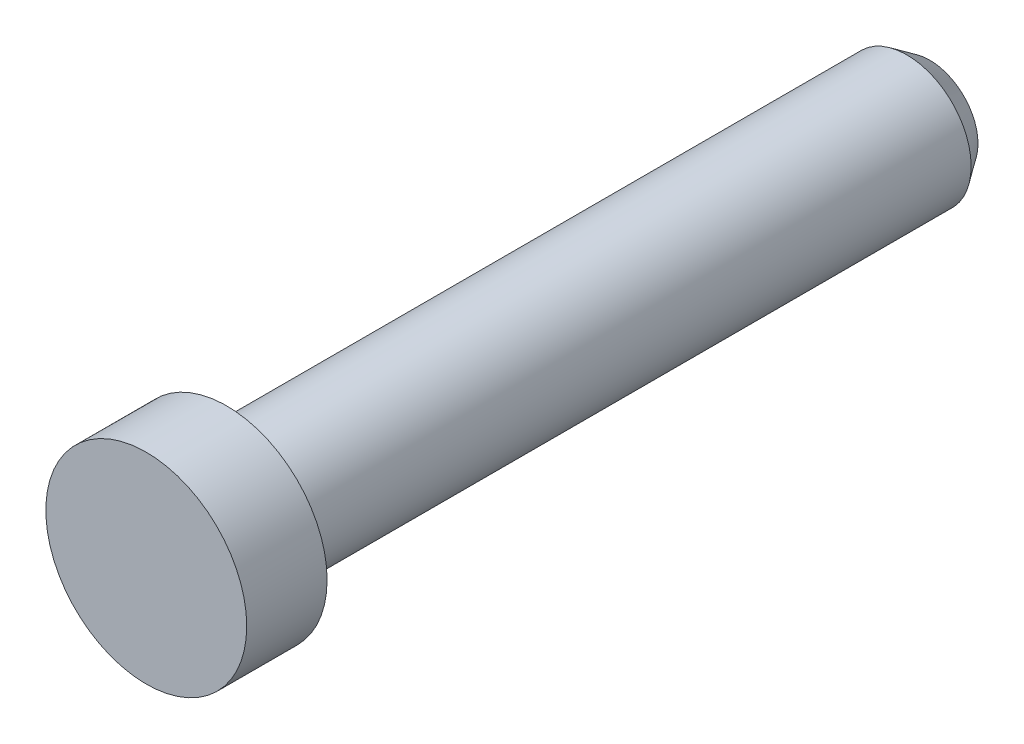
ISO-10303-21;
HEADER;
FILE_DESCRIPTION(('STEP AP214'),'2;1');
FILE_NAME('part.step','',(''),(''),'','','');
FILE_SCHEMA(('AUTOMOTIVE_DESIGN { 1 0 10303 214 1 1 1 1 }'));
ENDSEC;
DATA;
#1=APPLICATION_CONTEXT('core data for automotive mechanical design processes');
#2=APPLICATION_PROTOCOL_DEFINITION('international standard','automotive_design',2000,#1);
#3=PRODUCT_CONTEXT('',#1,'mechanical');
#4=PRODUCT('Part','Part','',(#3));
#5=PRODUCT_RELATED_PRODUCT_CATEGORY('part','',(#4));
#6=PRODUCT_DEFINITION_FORMATION('','',#4);
#7=PRODUCT_DEFINITION_CONTEXT('part definition',#1,'design');
#8=PRODUCT_DEFINITION('design','',#6,#7);
#9=PRODUCT_DEFINITION_SHAPE('','',#8);
#10=(LENGTH_UNIT() NAMED_UNIT(*) SI_UNIT(.MILLI.,.METRE.));
#11=(NAMED_UNIT(*) PLANE_ANGLE_UNIT() SI_UNIT($,.RADIAN.));
#12=(NAMED_UNIT(*) SI_UNIT($,.STERADIAN.) SOLID_ANGLE_UNIT());
#13=UNCERTAINTY_MEASURE_WITH_UNIT(LENGTH_MEASURE(1.E-05),#10,'distance_accuracy_value','');
#14=(GEOMETRIC_REPRESENTATION_CONTEXT(3) GLOBAL_UNCERTAINTY_ASSIGNED_CONTEXT((#13)) GLOBAL_UNIT_ASSIGNED_CONTEXT((#10,
#11,#12)) REPRESENTATION_CONTEXT('',''));
#15=CARTESIAN_POINT('',(0.,0.,0.));
#16=DIRECTION('',(0.,0.,1.));
#17=DIRECTION('',(1.,0.,0.));
#18=AXIS2_PLACEMENT_3D('',#15,#16,#17);
#19=CARTESIAN_POINT('',(0.,0.,8.75));
#20=DIRECTION('',(0.,0.,-1.));
#21=DIRECTION('',(-1.,0.,0.));
#22=AXIS2_PLACEMENT_3D('',#19,#20,#21);
#23=CYLINDRICAL_SURFACE('',#22,1.6);
#24=CARTESIAN_POINT('',(0.,0.,-8.17874079730315));
#25=DIRECTION('',(0.,0.,1.));
#26=DIRECTION('',(1.,0.,0.));
#27=AXIS2_PLACEMENT_3D('',#24,#25,#26);
#28=CIRCLE('',#27,1.6);
#29=CARTESIAN_POINT('',(1.6,0.,-8.17874079730315));
#30=VERTEX_POINT('',#29);
#31=EDGE_CURVE('E54',#30,#30,#28,.T.);
#32=ORIENTED_EDGE('',*,*,#31,.T.);
#33=EDGE_LOOP('',(#32));
#34=FACE_BOUND('',#33,.T.);
#35=CARTESIAN_POINT('',(0.,0.,8.75));
#36=DIRECTION('',(0.,0.,1.));
#37=DIRECTION('',(1.,0.,0.));
#38=AXIS2_PLACEMENT_3D('',#35,#36,#37);
#39=CIRCLE('',#38,1.6);
#40=CARTESIAN_POINT('',(1.6,0.,8.75));
#41=VERTEX_POINT('',#40);
#42=EDGE_CURVE('E59',#41,#41,#39,.T.);
#43=ORIENTED_EDGE('',*,*,#42,.F.);
#44=EDGE_LOOP('',(#43));
#45=FACE_BOUND('',#44,.T.);
#46=ADVANCED_FACE('F45',(#34,#45),#23,.T.);
#47=CARTESIAN_POINT('',(0.,0.,-8.75));
#48=DIRECTION('',(0.,0.,1.));
#49=DIRECTION('',(1.,0.,0.));
#50=AXIS2_PLACEMENT_3D('',#47,#48,#49);
#51=PLANE('',#50);
#52=CARTESIAN_POINT('',(0.,0.,-8.75));
#53=DIRECTION('',(0.,0.,1.));
#54=DIRECTION('',(1.,0.,0.));
#55=AXIS2_PLACEMENT_3D('',#52,#53,#54);
#56=CIRCLE('',#55,1.2);
#57=CARTESIAN_POINT('',(1.2,0.,-8.75));
#58=VERTEX_POINT('',#57);
#59=EDGE_CURVE('E10',#58,#58,#56,.F.);
#60=ORIENTED_EDGE('',*,*,#59,.T.);
#61=EDGE_LOOP('',(#60));
#62=FACE_BOUND('',#61,.T.);
#63=ADVANCED_FACE('F92',(#62),#51,.F.);
#64=CARTESIAN_POINT('',(0.,0.,-8.17874079730315));
#65=DIRECTION('',(0.,0.,1.));
#66=DIRECTION('',(1.,0.,0.));
#67=AXIS2_PLACEMENT_3D('',#64,#65,#66);
#68=CONICAL_SURFACE('',#67,1.6,0.610865238198017);
#69=CARTESIAN_POINT('',(1.2,0.,-8.75));
#70=CARTESIAN_POINT('',(1.20416666666666,0.,-8.74404938330524));
#71=CARTESIAN_POINT('',(1.20833333333333,0.,-8.73809876661048));
#72=CARTESIAN_POINT('',(1.21666666666666,0.,-8.72619753322097));
#73=CARTESIAN_POINT('',(1.22083333333333,0.,-8.72024691652621));
#74=CARTESIAN_POINT('',(1.22916666666666,0.,-8.70834568313669));
#75=CARTESIAN_POINT('',(1.23333333333333,0.,-8.70239506644193));
#76=CARTESIAN_POINT('',(1.24166666666666,0.,-8.69049383305241));
#77=CARTESIAN_POINT('',(1.24583333333333,0.,-8.68454321635766));
#78=CARTESIAN_POINT('',(1.25416666666666,0.,-8.67264198296814));
#79=CARTESIAN_POINT('',(1.25833333333333,0.,-8.66669136627338));
#80=CARTESIAN_POINT('',(1.26666666666666,0.,-8.65479013288386));
#81=CARTESIAN_POINT('',(1.27083333333333,0.,-8.6488395161891));
#82=CARTESIAN_POINT('',(1.27916666666666,0.,-8.63693828279958));
#83=CARTESIAN_POINT('',(1.28333333333333,0.,-8.63098766610483));
#84=CARTESIAN_POINT('',(1.29166666666666,0.,-8.61908643271531));
#85=CARTESIAN_POINT('',(1.29583333333333,0.,-8.61313581602055));
#86=CARTESIAN_POINT('',(1.30416666666666,0.,-8.60123458263103));
#87=CARTESIAN_POINT('',(1.30833333333333,0.,-8.59528396593627));
#88=CARTESIAN_POINT('',(1.31666666666666,0.,-8.58338273254675));
#89=CARTESIAN_POINT('',(1.32083333333333,0.,-8.577432115852));
#90=CARTESIAN_POINT('',(1.32916666666666,0.,-8.56553088246248));
#91=CARTESIAN_POINT('',(1.33333333333333,0.,-8.55958026576772));
#92=CARTESIAN_POINT('',(1.34166666666666,0.,-8.5476790323782));
#93=CARTESIAN_POINT('',(1.34583333333333,0.,-8.54172841568344));
#94=CARTESIAN_POINT('',(1.35416666666666,0.,-8.52982718229392));
#95=CARTESIAN_POINT('',(1.35833333333333,0.,-8.52387656559917));
#96=CARTESIAN_POINT('',(1.36666666666666,0.,-8.51197533220965));
#97=CARTESIAN_POINT('',(1.37083333333333,0.,-8.50602471551489));
#98=CARTESIAN_POINT('',(1.37916666666666,0.,-8.49412348212537));
#99=CARTESIAN_POINT('',(1.38333333333333,0.,-8.48817286543061));
#100=CARTESIAN_POINT('',(1.39166666666666,0.,-8.4762716320411));
#101=CARTESIAN_POINT('',(1.39583333333333,0.,-8.47032101534634));
#102=CARTESIAN_POINT('',(1.40416666666666,0.,-8.45841978195682));
#103=CARTESIAN_POINT('',(1.40833333333333,0.,-8.45246916526206));
#104=CARTESIAN_POINT('',(1.41666666666666,0.,-8.44056793187254));
#105=CARTESIAN_POINT('',(1.42083333333333,0.,-8.43461731517778));
#106=CARTESIAN_POINT('',(1.42916666666666,0.,-8.42271608178827));
#107=CARTESIAN_POINT('',(1.43333333333333,0.,-8.41676546509351));
#108=CARTESIAN_POINT('',(1.44166666666666,0.,-8.40486423170399));
#109=CARTESIAN_POINT('',(1.44583333333333,0.,-8.39891361500923));
#110=CARTESIAN_POINT('',(1.45416666666666,0.,-8.38701238161971));
#111=CARTESIAN_POINT('',(1.45833333333333,0.,-8.38106176492495));
#112=CARTESIAN_POINT('',(1.46666666666666,0.,-8.36916053153544));
#113=CARTESIAN_POINT('',(1.47083333333333,0.,-8.36320991484068));
#114=CARTESIAN_POINT('',(1.47916666666666,0.,-8.35130868145116));
#115=CARTESIAN_POINT('',(1.48333333333333,0.,-8.3453580647564));
#116=CARTESIAN_POINT('',(1.49166666666666,0.,-8.33345683136688));
#117=CARTESIAN_POINT('',(1.49583333333333,0.,-8.32750621467212));
#118=CARTESIAN_POINT('',(1.50416666666667,0.,-8.31560498128261));
#119=CARTESIAN_POINT('',(1.50833333333333,0.,-8.30965436458785));
#120=CARTESIAN_POINT('',(1.51666666666667,0.,-8.29775313119833));
#121=CARTESIAN_POINT('',(1.52083333333333,0.,-8.29180251450357));
#122=CARTESIAN_POINT('',(1.52916666666667,0.,-8.27990128111405));
#123=CARTESIAN_POINT('',(1.53333333333333,0.,-8.27395066441929));
#124=CARTESIAN_POINT('',(1.54166666666667,0.,-8.26204943102978));
#125=CARTESIAN_POINT('',(1.54583333333333,0.,-8.25609881433502));
#126=CARTESIAN_POINT('',(1.55416666666667,0.,-8.2441975809455));
#127=CARTESIAN_POINT('',(1.55833333333333,0.,-8.23824696425074));
#128=CARTESIAN_POINT('',(1.56666666666667,0.,-8.22634573086122));
#129=CARTESIAN_POINT('',(1.57083333333333,0.,-8.22039511416646));
#130=CARTESIAN_POINT('',(1.57916666666667,0.,-8.20849388077695));
#131=CARTESIAN_POINT('',(1.58333333333333,0.,-8.20254326408219));
#132=CARTESIAN_POINT('',(1.59166666666667,0.,-8.19064203069267));
#133=CARTESIAN_POINT('',(1.59583333333333,0.,-8.18469141399791));
#134=CARTESIAN_POINT('',(1.6,0.,-8.17874079730315));
#135=B_SPLINE_CURVE_WITH_KNOTS('',3,(#69,#70,#71,#72,#73,#74,#75,#76,#77,#78,#79,#80,#81,#82,
#83,#84,#85,#86,#87,#88,#89,#90,#91,#92,#93,#94,#95,#96,#97,#98,#99,#100,#101,#102,#103,#104,
#105,#106,#107,#108,#109,#110,#111,#112,#113,#114,#115,#116,#117,#118,#119,#120,#121,#122,#123,
#124,#125,#126,#127,#128,#129,#130,#131,#132,#133,#134),.UNSPECIFIED.,.F.,.F.,(4,2,2,2,2,2,2,2,
2,2,2,2,2,2,2,2,2,2,2,2,2,2,2,2,2,2,2,2,2,2,2,2,4),(0.,0.021793084945264,0.0435861698905278,
0.0653792548357917,0.0871723397810557,0.10896542472632,0.130758509671583,0.152551594616847,
0.174344679562111,0.196137764507375,0.217930849452639,0.239723934397903,0.261517019343167,
0.283310104288431,0.305103189233695,0.326896274178959,0.348689359124222,0.370482444069486,
0.39227552901475,0.414068613960014,0.435861698905278,0.457654783850542,0.479447868795806,
0.50124095374107,0.523034038686334,0.544827123631598,0.566620208576862,0.588413293522126,
0.610206378467391,0.631999463412655,0.653792548357919,0.675585633303182,0.697378718248446),.UNSPECIFIED.);
#136=EDGE_CURVE('BSEAM48',#58,#30,#135,.T.);
#137=ORIENTED_EDGE('',*,*,#59,.F.);
#138=ORIENTED_EDGE('',*,*,#31,.F.);
#139=ORIENTED_EDGE('',*,*,#136,.T.);
#140=ORIENTED_EDGE('',*,*,#136,.F.);
#141=EDGE_LOOP('',(#137,#139,#138,#140));
#142=FACE_BOUND('',#141,.T.);
#143=ADVANCED_FACE('F48',(#142),#68,.T.);
#144=CARTESIAN_POINT('',(0.,0.,10.75));
#145=DIRECTION('',(0.,0.,-1.));
#146=DIRECTION('',(-1.,0.,0.));
#147=AXIS2_PLACEMENT_3D('',#144,#145,#146);
#148=CYLINDRICAL_SURFACE('',#147,2.5);
#149=CARTESIAN_POINT('',(0.,0.,10.75));
#150=DIRECTION('',(0.,0.,1.));
#151=DIRECTION('',(1.,0.,0.));
#152=AXIS2_PLACEMENT_3D('',#149,#150,#151);
#153=CIRCLE('',#152,2.5);
#154=CARTESIAN_POINT('',(2.5,0.,10.75));
#155=VERTEX_POINT('',#154);
#156=EDGE_CURVE('E64',#155,#155,#153,.T.);
#157=ORIENTED_EDGE('',*,*,#156,.F.);
#158=EDGE_LOOP('',(#157));
#159=FACE_BOUND('',#158,.T.);
#160=CARTESIAN_POINT('',(0.,0.,8.75));
#161=DIRECTION('',(0.,0.,1.));
#162=DIRECTION('',(1.,0.,0.));
#163=AXIS2_PLACEMENT_3D('',#160,#161,#162);
#164=CIRCLE('',#163,2.5);
#165=CARTESIAN_POINT('',(2.5,0.,8.75));
#166=VERTEX_POINT('',#165);
#167=EDGE_CURVE('E67',#166,#166,#164,.T.);
#168=ORIENTED_EDGE('',*,*,#167,.T.);
#169=EDGE_LOOP('',(#168));
#170=FACE_BOUND('',#169,.T.);
#171=ADVANCED_FACE('F77',(#159,#170),#148,.T.);
#172=CARTESIAN_POINT('',(0.,0.,10.75));
#173=DIRECTION('',(0.,0.,1.));
#174=DIRECTION('',(1.,0.,0.));
#175=AXIS2_PLACEMENT_3D('',#172,#173,#174);
#176=PLANE('',#175);
#177=ORIENTED_EDGE('',*,*,#156,.T.);
#178=EDGE_LOOP('',(#177));
#179=FACE_BOUND('',#178,.T.);
#180=ADVANCED_FACE('F75',(#179),#176,.T.);
#181=CARTESIAN_POINT('',(0.,0.,8.75));
#182=DIRECTION('',(0.,0.,1.));
#183=DIRECTION('',(1.,0.,0.));
#184=AXIS2_PLACEMENT_3D('',#181,#182,#183);
#185=PLANE('',#184);
#186=ORIENTED_EDGE('',*,*,#42,.T.);
#187=EDGE_LOOP('',(#186));
#188=FACE_BOUND('',#187,.T.);
#189=ORIENTED_EDGE('',*,*,#167,.F.);
#190=EDGE_LOOP('',(#189));
#191=FACE_BOUND('',#190,.T.);
#192=ADVANCED_FACE('F83',(#188,#191),#185,.F.);
#193=CLOSED_SHELL('',(#46,#63,#143,#171,#180,#192));
#194=MANIFOLD_SOLID_BREP('B2',#193);
#195=ADVANCED_BREP_SHAPE_REPRESENTATION('',(#18,#194),#14);
#196=SHAPE_DEFINITION_REPRESENTATION(#9,#195);
ENDSEC;
END-ISO-10303-21;
